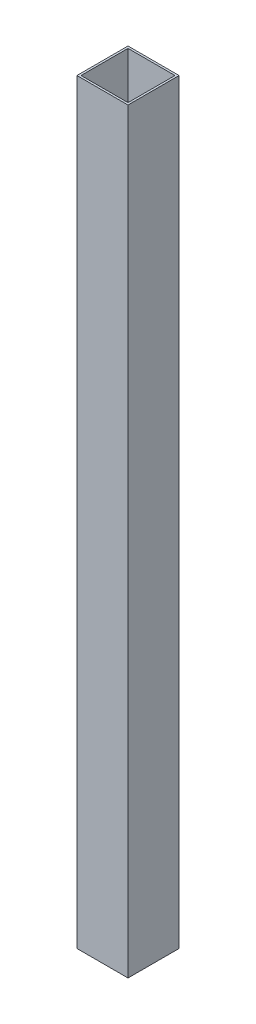
ISO-10303-21;
HEADER;
FILE_DESCRIPTION(('STEP AP214'),'2;1');
FILE_NAME('part.step','',(''),(''),'','','');
FILE_SCHEMA(('AUTOMOTIVE_DESIGN { 1 0 10303 214 1 1 1 1 }'));
ENDSEC;
DATA;
#1=APPLICATION_CONTEXT('core data for automotive mechanical design processes');
#2=APPLICATION_PROTOCOL_DEFINITION('international standard','automotive_design',2000,#1);
#3=PRODUCT_CONTEXT('',#1,'mechanical');
#4=PRODUCT('Part','Part','',(#3));
#5=PRODUCT_RELATED_PRODUCT_CATEGORY('part','',(#4));
#6=PRODUCT_DEFINITION_FORMATION('','',#4);
#7=PRODUCT_DEFINITION_CONTEXT('part definition',#1,'design');
#8=PRODUCT_DEFINITION('design','',#6,#7);
#9=PRODUCT_DEFINITION_SHAPE('','',#8);
#10=(LENGTH_UNIT() NAMED_UNIT(*) SI_UNIT(.MILLI.,.METRE.));
#11=(NAMED_UNIT(*) PLANE_ANGLE_UNIT() SI_UNIT($,.RADIAN.));
#12=(NAMED_UNIT(*) SI_UNIT($,.STERADIAN.) SOLID_ANGLE_UNIT());
#13=UNCERTAINTY_MEASURE_WITH_UNIT(LENGTH_MEASURE(1.E-05),#10,'distance_accuracy_value','');
#14=(GEOMETRIC_REPRESENTATION_CONTEXT(3) GLOBAL_UNCERTAINTY_ASSIGNED_CONTEXT((#13)) GLOBAL_UNIT_ASSIGNED_CONTEXT((#10,
#11,#12)) REPRESENTATION_CONTEXT('',''));
#15=CARTESIAN_POINT('',(0.,0.,0.));
#16=DIRECTION('',(0.,0.,1.));
#17=DIRECTION('',(1.,0.,0.));
#18=AXIS2_PLACEMENT_3D('',#15,#16,#17);
#19=CARTESIAN_POINT('',(25.,740.,-25.));
#20=DIRECTION('',(-1.,0.,0.));
#21=DIRECTION('',(0.,0.,1.));
#22=AXIS2_PLACEMENT_3D('',#19,#20,#21);
#23=PLANE('',#22);
#24=DIRECTION('',(0.,0.,-1.));
#25=VECTOR('',#24,1.);
#26=CARTESIAN_POINT('',(25.,0.,-25.));
#27=LINE('',#26,#25);
#28=CARTESIAN_POINT('',(25.,0.,25.));
#29=VERTEX_POINT('',#28);
#30=CARTESIAN_POINT('',(25.,0.,-25.));
#31=VERTEX_POINT('',#30);
#32=EDGE_CURVE('E149',#29,#31,#27,.T.);
#33=ORIENTED_EDGE('',*,*,#32,.T.);
#34=DIRECTION('',(0.,-1.,0.));
#35=VECTOR('',#34,1.);
#36=CARTESIAN_POINT('',(25.,740.,-25.));
#37=LINE('',#36,#35);
#38=CARTESIAN_POINT('',(25.,740.,-25.));
#39=VERTEX_POINT('',#38);
#40=EDGE_CURVE('E11',#39,#31,#37,.T.);
#41=ORIENTED_EDGE('',*,*,#40,.F.);
#42=DIRECTION('',(0.,0.,-1.));
#43=VECTOR('',#42,1.);
#44=CARTESIAN_POINT('',(25.,740.,-25.));
#45=LINE('',#44,#43);
#46=CARTESIAN_POINT('',(25.,740.,25.));
#47=VERTEX_POINT('',#46);
#48=EDGE_CURVE('E142',#47,#39,#45,.T.);
#49=ORIENTED_EDGE('',*,*,#48,.F.);
#50=DIRECTION('',(0.,-1.,0.));
#51=VECTOR('',#50,1.);
#52=CARTESIAN_POINT('',(25.,740.,25.));
#53=LINE('',#52,#51);
#54=EDGE_CURVE('E148',#47,#29,#53,.T.);
#55=ORIENTED_EDGE('',*,*,#54,.T.);
#56=EDGE_LOOP('',(#33,#41,#49,#55));
#57=FACE_BOUND('',#56,.T.);
#58=ADVANCED_FACE('F35',(#57),#23,.F.);
#59=CARTESIAN_POINT('',(-25.,740.,-25.));
#60=DIRECTION('',(0.,0.,1.));
#61=DIRECTION('',(1.,0.,0.));
#62=AXIS2_PLACEMENT_3D('',#59,#60,#61);
#63=PLANE('',#62);
#64=DIRECTION('',(-1.,0.,0.));
#65=VECTOR('',#64,1.);
#66=CARTESIAN_POINT('',(-25.,0.,-25.));
#67=LINE('',#66,#65);
#68=CARTESIAN_POINT('',(-25.,0.,-25.));
#69=VERTEX_POINT('',#68);
#70=EDGE_CURVE('E152',#31,#69,#67,.T.);
#71=ORIENTED_EDGE('',*,*,#70,.T.);
#72=DIRECTION('',(0.,-1.,0.));
#73=VECTOR('',#72,1.);
#74=CARTESIAN_POINT('',(-25.,740.,-25.));
#75=LINE('',#74,#73);
#76=CARTESIAN_POINT('',(-25.,740.,-25.));
#77=VERTEX_POINT('',#76);
#78=EDGE_CURVE('E42',#77,#69,#75,.T.);
#79=ORIENTED_EDGE('',*,*,#78,.F.);
#80=DIRECTION('',(-1.,0.,0.));
#81=VECTOR('',#80,1.);
#82=CARTESIAN_POINT('',(-25.,740.,-25.));
#83=LINE('',#82,#81);
#84=EDGE_CURVE('E86',#39,#77,#83,.T.);
#85=ORIENTED_EDGE('',*,*,#84,.F.);
#86=ORIENTED_EDGE('',*,*,#40,.T.);
#87=EDGE_LOOP('',(#71,#79,#85,#86));
#88=FACE_BOUND('',#87,.T.);
#89=ADVANCED_FACE('F181',(#88),#63,.F.);
#90=CARTESIAN_POINT('',(-25.,740.,-25.));
#91=DIRECTION('',(1.,0.,0.));
#92=DIRECTION('',(0.,0.,-1.));
#93=AXIS2_PLACEMENT_3D('',#90,#91,#92);
#94=PLANE('',#93);
#95=DIRECTION('',(0.,0.,1.));
#96=VECTOR('',#95,1.);
#97=CARTESIAN_POINT('',(-25.,0.,-25.));
#98=LINE('',#97,#96);
#99=CARTESIAN_POINT('',(-25.,0.,25.));
#100=VERTEX_POINT('',#99);
#101=EDGE_CURVE('E154',#69,#100,#98,.T.);
#102=ORIENTED_EDGE('',*,*,#101,.T.);
#103=DIRECTION('',(0.,-1.,0.));
#104=VECTOR('',#103,1.);
#105=CARTESIAN_POINT('',(-25.,740.,25.));
#106=LINE('',#105,#104);
#107=CARTESIAN_POINT('',(-25.,740.,25.));
#108=VERTEX_POINT('',#107);
#109=EDGE_CURVE('E158',#108,#100,#106,.T.);
#110=ORIENTED_EDGE('',*,*,#109,.F.);
#111=DIRECTION('',(0.,0.,1.));
#112=VECTOR('',#111,1.);
#113=CARTESIAN_POINT('',(-25.,740.,-25.));
#114=LINE('',#113,#112);
#115=EDGE_CURVE('E145',#77,#108,#114,.T.);
#116=ORIENTED_EDGE('',*,*,#115,.F.);
#117=ORIENTED_EDGE('',*,*,#78,.T.);
#118=EDGE_LOOP('',(#102,#110,#116,#117));
#119=FACE_BOUND('',#118,.T.);
#120=ADVANCED_FACE('F163',(#119),#94,.F.);
#121=CARTESIAN_POINT('',(-25.,740.,25.));
#122=DIRECTION('',(0.,0.,-1.));
#123=DIRECTION('',(-1.,0.,0.));
#124=AXIS2_PLACEMENT_3D('',#121,#122,#123);
#125=PLANE('',#124);
#126=DIRECTION('',(1.,0.,0.));
#127=VECTOR('',#126,1.);
#128=CARTESIAN_POINT('',(-25.,0.,25.));
#129=LINE('',#128,#127);
#130=EDGE_CURVE('E79',#100,#29,#129,.T.);
#131=ORIENTED_EDGE('',*,*,#130,.T.);
#132=ORIENTED_EDGE('',*,*,#54,.F.);
#133=DIRECTION('',(1.,0.,0.));
#134=VECTOR('',#133,1.);
#135=CARTESIAN_POINT('',(-25.,740.,25.));
#136=LINE('',#135,#134);
#137=EDGE_CURVE('E58',#108,#47,#136,.T.);
#138=ORIENTED_EDGE('',*,*,#137,.F.);
#139=ORIENTED_EDGE('',*,*,#109,.T.);
#140=EDGE_LOOP('',(#131,#132,#138,#139));
#141=FACE_BOUND('',#140,.T.);
#142=ADVANCED_FACE('F171',(#141),#125,.F.);
#143=CARTESIAN_POINT('',(0.,740.,0.));
#144=DIRECTION('',(0.,1.,0.));
#145=DIRECTION('',(0.,0.,1.));
#146=AXIS2_PLACEMENT_3D('',#143,#144,#145);
#147=PLANE('',#146);
#148=DIRECTION('',(0.,0.,-1.));
#149=VECTOR('',#148,1.);
#150=CARTESIAN_POINT('',(23.,740.,-25.));
#151=LINE('',#150,#149);
#152=CARTESIAN_POINT('',(23.,740.,23.));
#153=VERTEX_POINT('',#152);
#154=CARTESIAN_POINT('',(23.,740.,-23.));
#155=VERTEX_POINT('',#154);
#156=EDGE_CURVE('E131',#153,#155,#151,.T.);
#157=ORIENTED_EDGE('',*,*,#156,.F.);
#158=DIRECTION('',(1.,0.,0.));
#159=VECTOR('',#158,1.);
#160=CARTESIAN_POINT('',(-25.,740.,23.));
#161=LINE('',#160,#159);
#162=CARTESIAN_POINT('',(-23.,740.,23.));
#163=VERTEX_POINT('',#162);
#164=EDGE_CURVE('E140',#163,#153,#161,.T.);
#165=ORIENTED_EDGE('',*,*,#164,.F.);
#166=DIRECTION('',(0.,0.,1.));
#167=VECTOR('',#166,1.);
#168=CARTESIAN_POINT('',(-23.,740.,-25.));
#169=LINE('',#168,#167);
#170=CARTESIAN_POINT('',(-23.,740.,-23.));
#171=VERTEX_POINT('',#170);
#172=EDGE_CURVE('E138',#171,#163,#169,.T.);
#173=ORIENTED_EDGE('',*,*,#172,.F.);
#174=DIRECTION('',(-1.,0.,0.));
#175=VECTOR('',#174,1.);
#176=CARTESIAN_POINT('',(-25.,740.,-23.));
#177=LINE('',#176,#175);
#178=EDGE_CURVE('E123',#155,#171,#177,.T.);
#179=ORIENTED_EDGE('',*,*,#178,.F.);
#180=EDGE_LOOP('',(#157,#165,#173,#179));
#181=FACE_BOUND('',#180,.T.);
#182=ORIENTED_EDGE('',*,*,#48,.T.);
#183=ORIENTED_EDGE('',*,*,#84,.T.);
#184=ORIENTED_EDGE('',*,*,#115,.T.);
#185=ORIENTED_EDGE('',*,*,#137,.T.);
#186=EDGE_LOOP('',(#182,#183,#184,#185));
#187=FACE_BOUND('',#186,.T.);
#188=ADVANCED_FACE('F173',(#181,#187),#147,.T.);
#189=CARTESIAN_POINT('',(0.,0.,0.));
#190=DIRECTION('',(0.,1.,0.));
#191=DIRECTION('',(0.,0.,1.));
#192=AXIS2_PLACEMENT_3D('',#189,#190,#191);
#193=PLANE('',#192);
#194=ORIENTED_EDGE('',*,*,#32,.F.);
#195=ORIENTED_EDGE('',*,*,#130,.F.);
#196=ORIENTED_EDGE('',*,*,#101,.F.);
#197=ORIENTED_EDGE('',*,*,#70,.F.);
#198=EDGE_LOOP('',(#194,#195,#196,#197));
#199=FACE_BOUND('',#198,.T.);
#200=ADVANCED_FACE('F167',(#199),#193,.F.);
#201=CARTESIAN_POINT('',(23.,740.,-25.));
#202=DIRECTION('',(-1.,0.,0.));
#203=DIRECTION('',(0.,0.,1.));
#204=AXIS2_PLACEMENT_3D('',#201,#202,#203);
#205=PLANE('',#204);
#206=DIRECTION('',(0.,0.,-1.));
#207=VECTOR('',#206,1.);
#208=CARTESIAN_POINT('',(23.,2.,-25.));
#209=LINE('',#208,#207);
#210=CARTESIAN_POINT('',(23.,2.,23.));
#211=VERTEX_POINT('',#210);
#212=CARTESIAN_POINT('',(23.,2.,-23.));
#213=VERTEX_POINT('',#212);
#214=EDGE_CURVE('E114',#211,#213,#209,.T.);
#215=ORIENTED_EDGE('',*,*,#214,.F.);
#216=DIRECTION('',(0.,-1.,0.));
#217=VECTOR('',#216,1.);
#218=CARTESIAN_POINT('',(23.,740.,23.));
#219=LINE('',#218,#217);
#220=EDGE_CURVE('E134',#153,#211,#219,.T.);
#221=ORIENTED_EDGE('',*,*,#220,.F.);
#222=ORIENTED_EDGE('',*,*,#156,.T.);
#223=DIRECTION('',(0.,-1.,0.));
#224=VECTOR('',#223,1.);
#225=CARTESIAN_POINT('',(23.,740.,-23.));
#226=LINE('',#225,#224);
#227=EDGE_CURVE('E126',#155,#213,#226,.T.);
#228=ORIENTED_EDGE('',*,*,#227,.T.);
#229=EDGE_LOOP('',(#215,#221,#222,#228));
#230=FACE_BOUND('',#229,.T.);
#231=ADVANCED_FACE('F208',(#230),#205,.T.);
#232=CARTESIAN_POINT('',(-25.,740.,-23.));
#233=DIRECTION('',(0.,0.,1.));
#234=DIRECTION('',(1.,0.,0.));
#235=AXIS2_PLACEMENT_3D('',#232,#233,#234);
#236=PLANE('',#235);
#237=DIRECTION('',(-1.,0.,0.));
#238=VECTOR('',#237,1.);
#239=CARTESIAN_POINT('',(-25.,2.,-23.));
#240=LINE('',#239,#238);
#241=CARTESIAN_POINT('',(-23.,2.,-23.));
#242=VERTEX_POINT('',#241);
#243=EDGE_CURVE('E108',#213,#242,#240,.T.);
#244=ORIENTED_EDGE('',*,*,#243,.F.);
#245=ORIENTED_EDGE('',*,*,#227,.F.);
#246=ORIENTED_EDGE('',*,*,#178,.T.);
#247=DIRECTION('',(0.,-1.,0.));
#248=VECTOR('',#247,1.);
#249=CARTESIAN_POINT('',(-23.,740.,-23.));
#250=LINE('',#249,#248);
#251=EDGE_CURVE('E120',#171,#242,#250,.T.);
#252=ORIENTED_EDGE('',*,*,#251,.T.);
#253=EDGE_LOOP('',(#244,#245,#246,#252));
#254=FACE_BOUND('',#253,.T.);
#255=ADVANCED_FACE('F121',(#254),#236,.T.);
#256=CARTESIAN_POINT('',(-23.,740.,-25.));
#257=DIRECTION('',(1.,0.,0.));
#258=DIRECTION('',(0.,0.,-1.));
#259=AXIS2_PLACEMENT_3D('',#256,#257,#258);
#260=PLANE('',#259);
#261=DIRECTION('',(0.,0.,1.));
#262=VECTOR('',#261,1.);
#263=CARTESIAN_POINT('',(-23.,2.,-25.));
#264=LINE('',#263,#262);
#265=CARTESIAN_POINT('',(-23.,2.,23.));
#266=VERTEX_POINT('',#265);
#267=EDGE_CURVE('E112',#242,#266,#264,.T.);
#268=ORIENTED_EDGE('',*,*,#267,.F.);
#269=ORIENTED_EDGE('',*,*,#251,.F.);
#270=ORIENTED_EDGE('',*,*,#172,.T.);
#271=DIRECTION('',(0.,-1.,0.));
#272=VECTOR('',#271,1.);
#273=CARTESIAN_POINT('',(-23.,740.,23.));
#274=LINE('',#273,#272);
#275=EDGE_CURVE('E49',#163,#266,#274,.T.);
#276=ORIENTED_EDGE('',*,*,#275,.T.);
#277=EDGE_LOOP('',(#268,#269,#270,#276));
#278=FACE_BOUND('',#277,.T.);
#279=ADVANCED_FACE('F128',(#278),#260,.T.);
#280=CARTESIAN_POINT('',(-25.,740.,23.));
#281=DIRECTION('',(0.,0.,-1.));
#282=DIRECTION('',(-1.,0.,0.));
#283=AXIS2_PLACEMENT_3D('',#280,#281,#282);
#284=PLANE('',#283);
#285=DIRECTION('',(1.,0.,0.));
#286=VECTOR('',#285,1.);
#287=CARTESIAN_POINT('',(-25.,2.,23.));
#288=LINE('',#287,#286);
#289=EDGE_CURVE('E129',#266,#211,#288,.T.);
#290=ORIENTED_EDGE('',*,*,#289,.F.);
#291=ORIENTED_EDGE('',*,*,#275,.F.);
#292=ORIENTED_EDGE('',*,*,#164,.T.);
#293=ORIENTED_EDGE('',*,*,#220,.T.);
#294=EDGE_LOOP('',(#290,#291,#292,#293));
#295=FACE_BOUND('',#294,.T.);
#296=ADVANCED_FACE('F240',(#295),#284,.T.);
#297=CARTESIAN_POINT('',(0.,2.,0.));
#298=DIRECTION('',(0.,1.,0.));
#299=DIRECTION('',(0.,0.,1.));
#300=AXIS2_PLACEMENT_3D('',#297,#298,#299);
#301=PLANE('',#300);
#302=ORIENTED_EDGE('',*,*,#214,.T.);
#303=ORIENTED_EDGE('',*,*,#243,.T.);
#304=ORIENTED_EDGE('',*,*,#267,.T.);
#305=ORIENTED_EDGE('',*,*,#289,.T.);
#306=EDGE_LOOP('',(#302,#303,#304,#305));
#307=FACE_BOUND('',#306,.T.);
#308=ADVANCED_FACE('F110',(#307),#301,.T.);
#309=CLOSED_SHELL('',(#58,#89,#120,#142,#188,#200,#231,#255,#279,#296,#308));
#310=MANIFOLD_SOLID_BREP('B2',#309);
#311=ADVANCED_BREP_SHAPE_REPRESENTATION('',(#18,#310),#14);
#312=SHAPE_DEFINITION_REPRESENTATION(#9,#311);
ENDSEC;
END-ISO-10303-21;
